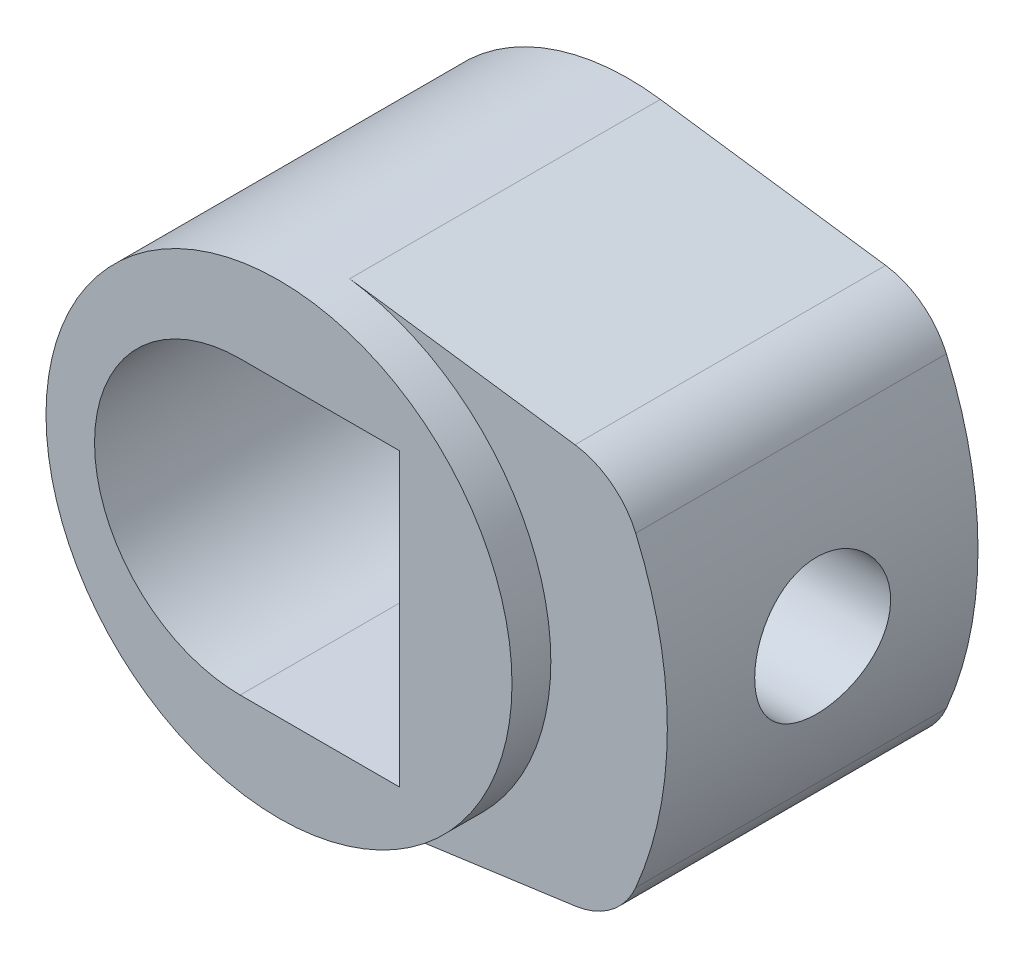
ISO-10303-21;
HEADER;
FILE_DESCRIPTION(('STEP AP214'),'2;1');
FILE_NAME('part.step','',(''),(''),'','','');
FILE_SCHEMA(('AUTOMOTIVE_DESIGN { 1 0 10303 214 1 1 1 1 }'));
ENDSEC;
DATA;
#1=APPLICATION_CONTEXT('core data for automotive mechanical design processes');
#2=APPLICATION_PROTOCOL_DEFINITION('international standard','automotive_design',2000,#1);
#3=PRODUCT_CONTEXT('',#1,'mechanical');
#4=PRODUCT('Part','Part','',(#3));
#5=PRODUCT_RELATED_PRODUCT_CATEGORY('part','',(#4));
#6=PRODUCT_DEFINITION_FORMATION('','',#4);
#7=PRODUCT_DEFINITION_CONTEXT('part definition',#1,'design');
#8=PRODUCT_DEFINITION('design','',#6,#7);
#9=PRODUCT_DEFINITION_SHAPE('','',#8);
#10=(LENGTH_UNIT() NAMED_UNIT(*) SI_UNIT(.MILLI.,.METRE.));
#11=(NAMED_UNIT(*) PLANE_ANGLE_UNIT() SI_UNIT($,.RADIAN.));
#12=(NAMED_UNIT(*) SI_UNIT($,.STERADIAN.) SOLID_ANGLE_UNIT());
#13=UNCERTAINTY_MEASURE_WITH_UNIT(LENGTH_MEASURE(1.E-05),#10,'distance_accuracy_value','');
#14=(GEOMETRIC_REPRESENTATION_CONTEXT(3) GLOBAL_UNCERTAINTY_ASSIGNED_CONTEXT((#13)) GLOBAL_UNIT_ASSIGNED_CONTEXT((#10,
#11,#12)) REPRESENTATION_CONTEXT('',''));
#15=CARTESIAN_POINT('',(0.,0.,0.));
#16=DIRECTION('',(0.,0.,1.));
#17=DIRECTION('',(1.,0.,0.));
#18=AXIS2_PLACEMENT_3D('',#15,#16,#17);
#19=CARTESIAN_POINT('',(0.,0.,-9.));
#20=DIRECTION('',(0.,0.,1.));
#21=DIRECTION('',(1.,0.,0.));
#22=AXIS2_PLACEMENT_3D('',#19,#20,#21);
#23=CYLINDRICAL_SURFACE('',#22,10.);
#24=CARTESIAN_POINT('',(10.,0.,-3.25000000000001));
#25=CARTESIAN_POINT('',(9.99999828550993,-0.0975002189978529,-3.25000384235494));
#26=CARTESIAN_POINT('',(9.99855925305814,-0.195051825485914,-3.25817578126177));
#27=CARTESIAN_POINT('',(9.99295728726595,-0.387414018862523,-3.2906311549575));
#28=CARTESIAN_POINT('',(9.98879192868944,-0.482222086719282,-3.31492893495113));
#29=CARTESIAN_POINT('',(9.9782040279162,-0.666286716106649,-3.37887573799504));
#30=CARTESIAN_POINT('',(9.97178340721726,-0.755547927638459,-3.41851169573414));
#31=CARTESIAN_POINT('',(9.95738907196248,-0.926142975369663,-3.51197438406103));
#32=CARTESIAN_POINT('',(9.94941551484513,-1.00747761392112,-3.56579967631304));
#33=CARTESIAN_POINT('',(9.93270416872809,-1.16077458064915,-3.68671360977965));
#34=CARTESIAN_POINT('',(9.92395990203815,-1.23264164981102,-3.75392213964217));
#35=CARTESIAN_POINT('',(9.90674166321202,-1.36414009649867,-3.89943673693522));
#36=CARTESIAN_POINT('',(9.89826770904785,-1.42377066189349,-3.97774354037016));
#37=CARTESIAN_POINT('',(9.88248675123969,-1.52949079919483,-4.1438935627265));
#38=CARTESIAN_POINT('',(9.87518811175402,-1.57548512024471,-4.23179825310341));
#39=CARTESIAN_POINT('',(9.86267461199113,-1.65201780170522,-4.41423539240781));
#40=CARTESIAN_POINT('',(9.85745959606453,-1.68255731665528,-4.50876734564985));
#41=CARTESIAN_POINT('',(9.84976858920675,-1.72701116059029,-4.70076203144143));
#42=CARTESIAN_POINT('',(9.84726541290427,-1.74109061199909,-4.79818542209425));
#43=CARTESIAN_POINT('',(9.84519938186275,-1.75273685009324,-4.99404146761843));
#44=CARTESIAN_POINT('',(9.84563629768554,-1.75030492528907,-5.09247404313671));
#45=CARTESIAN_POINT('',(9.84937629026662,-1.72913170713862,-5.28636885043278));
#46=CARTESIAN_POINT('',(9.85264661495795,-1.71057677642294,-5.3818521571407));
#47=CARTESIAN_POINT('',(9.86163360747697,-1.65797711614929,-5.56832923234216));
#48=CARTESIAN_POINT('',(9.8673503670103,-1.62393180592481,-5.65932283239451));
#49=CARTESIAN_POINT('',(9.88062103436221,-1.54113146110184,-5.83479054450863));
#50=CARTESIAN_POINT('',(9.88818446324519,-1.49229986742932,-5.91922777986089));
#51=CARTESIAN_POINT('',(9.9042897774119,-1.38136737793408,-6.07878036908094));
#52=CARTESIAN_POINT('',(9.91283174952347,-1.31926530417513,-6.15389489449472));
#53=CARTESIAN_POINT('',(9.93007513845501,-1.18254340376587,-6.29374783449876));
#54=CARTESIAN_POINT('',(9.93877713730826,-1.10776386811213,-6.3583301455674));
#55=CARTESIAN_POINT('',(9.95525225092692,-0.948347681177363,-6.47405494422539));
#56=CARTESIAN_POINT('',(9.96302535851272,-0.863710953717835,-6.52519732793814));
#57=CARTESIAN_POINT('',(9.9767796289067,-0.686829936517542,-6.61260810815593));
#58=CARTESIAN_POINT('',(9.98275901510707,-0.594578218974177,-6.64886177101598));
#59=CARTESIAN_POINT('',(9.99223809398106,-0.405166996122789,-6.70531614693626));
#60=CARTESIAN_POINT('',(9.99573801564457,-0.308007944917595,-6.72551834244392));
#61=CARTESIAN_POINT('',(9.99983277218685,-0.11288455469102,-6.74908251522554));
#62=CARTESIAN_POINT('',(10.0004645449945,-0.0149468247783658,-6.75265862880128));
#63=CARTESIAN_POINT('',(9.99885332409997,0.180127849653306,-6.74344137392768));
#64=CARTESIAN_POINT('',(9.99661045277387,0.277264828083822,-6.73064870231137));
#65=CARTESIAN_POINT('',(9.98952487073635,0.467312333780234,-6.68923510573546));
#66=CARTESIAN_POINT('',(9.98469972832698,0.560246871912314,-6.66072110058933));
#67=CARTESIAN_POINT('',(9.97298839379761,0.740016494745386,-6.58878888978056));
#68=CARTESIAN_POINT('',(9.96610207629161,0.826851207983171,-6.54536977738249));
#69=CARTESIAN_POINT('',(9.95094034029616,0.992880142059938,-6.44437581192406));
#70=CARTESIAN_POINT('',(9.94265215093101,1.07199249157211,-6.38666832163301));
#71=CARTESIAN_POINT('',(9.92564223228564,1.21948701016863,-6.25891699986686));
#72=CARTESIAN_POINT('',(9.91692046810972,1.28786831373203,-6.18887217428031));
#73=CARTESIAN_POINT('',(9.89990574738798,1.41276114994019,-6.03747050493884));
#74=CARTESIAN_POINT('',(9.89161886212633,1.46912742425076,-5.9559930439062));
#75=CARTESIAN_POINT('',(9.87652886958088,1.56737307241149,-5.78460016929627));
#76=CARTESIAN_POINT('',(9.86972571190741,1.60925293827063,-5.69468504242343));
#77=CARTESIAN_POINT('',(9.85841982497657,1.67712403732701,-5.5093608772062));
#78=CARTESIAN_POINT('',(9.8539069632688,1.70318535525292,-5.41397815237364));
#79=CARTESIAN_POINT('',(9.84766806310623,1.73889853467114,-5.2201026745908));
#80=CARTESIAN_POINT('',(9.84594175488492,1.74855198461552,-5.12161022363475));
#81=CARTESIAN_POINT('',(9.84548385302428,1.7511276529647,-4.92576329387006));
#82=CARTESIAN_POINT('',(9.84671130349955,1.74427868698101,-4.82841184522148));
#83=CARTESIAN_POINT('',(9.85193244878436,1.71454110321865,-4.63626987662235));
#84=CARTESIAN_POINT('',(9.85592613187508,1.69165255338979,-4.54147934582455));
#85=CARTESIAN_POINT('',(9.8662135332826,1.63057667594735,-4.35725185730661));
#86=CARTESIAN_POINT('',(9.87250399231302,1.5924110202649,-4.26780752124465));
#87=CARTESIAN_POINT('',(9.88667897086147,1.50188835743545,-4.09655457220386));
#88=CARTESIAN_POINT('',(9.89456358259495,1.44953052926744,-4.01474640134745));
#89=CARTESIAN_POINT('',(9.91116727642969,1.33130126747893,-3.85993571275723));
#90=CARTESIAN_POINT('',(9.91989591712334,1.2652621752978,-3.78706224154226));
#91=CARTESIAN_POINT('',(9.93712979259031,1.12189721587277,-3.65335379981883));
#92=CARTESIAN_POINT('',(9.94563497547267,1.04456875389407,-3.59252160445502));
#93=CARTESIAN_POINT('',(9.96153989384367,0.880110187392859,-3.48419059335616));
#94=CARTESIAN_POINT('',(9.9689306174897,0.792909225494808,-3.43679800089525));
#95=CARTESIAN_POINT('',(9.98168617899541,0.611686626292541,-3.35740872413027));
#96=CARTESIAN_POINT('',(9.98705298938607,0.517671737050136,-3.32539704101543));
#97=CARTESIAN_POINT('',(9.99401440275851,0.352770470007624,-3.28445441936028));
#98=CARTESIAN_POINT('',(9.99624674471591,0.282869378105651,-3.27155523305155));
#99=CARTESIAN_POINT('',(9.99924015281871,0.141987928142366,-3.25432671061564));
#100=CARTESIAN_POINT('',(10.0000012486312,0.0710075918726418,-3.24999720168455));
#101=CARTESIAN_POINT('',(10.,0.,-3.25000000000001));
#102=B_SPLINE_CURVE_WITH_KNOTS('',3,(#24,#25,#26,#27,#28,#29,#30,#31,#32,#33,#34,#35,#36,#37,
#38,#39,#40,#41,#42,#43,#44,#45,#46,#47,#48,#49,#50,#51,#52,#53,#54,#55,#56,#57,#58,#59,#60,#61,
#62,#63,#64,#65,#66,#67,#68,#69,#70,#71,#72,#73,#74,#75,#76,#77,#78,#79,#80,#81,#82,#83,#84,#85,
#86,#87,#88,#89,#90,#91,#92,#93,#94,#95,#96,#97,#98,#99,#100,#101),.UNSPECIFIED.,.T.,.F.,(4,2,2,
2,2,2,2,2,2,2,2,2,2,2,2,2,2,2,2,2,2,2,2,2,2,2,2,2,2,2,2,2,2,2,2,2,2,2,4),(0.,0.292241055917432,
0.58474243233977,0.876995197804949,1.16921834975456,1.46418766399022,1.75917654887267,
2.05617988256741,2.35316102557936,2.64713665953461,2.9410893525595,3.23168883340739,
3.5222992084548,3.8144407835363,4.10660830094939,4.40277504865977,4.69894408536265,
4.99540550415928,5.29183953981626,5.58444486552991,5.87703773520181,6.1676648150215,
6.45830957794646,6.7517607570431,7.04523559252416,7.34207911218896,7.63891254902186,
7.93442106632092,8.22990097369562,8.52130751120692,8.81271281421598,9.10370618969565,
9.39471640281469,9.68952963439962,9.98441073248084,10.2815613716727,10.5784216510767,
10.7912596559021,11.0040933688958),.UNSPECIFIED.);
#103=CARTESIAN_POINT('',(10.,0.,-3.25000000000001));
#104=VERTEX_POINT('',#103);
#105=EDGE_CURVE('E234',#104,#104,#102,.T.);
#106=ORIENTED_EDGE('',*,*,#105,.F.);
#107=EDGE_LOOP('',(#106));
#108=FACE_BOUND('',#107,.T.);
#109=CARTESIAN_POINT('',(0.,0.,-1.));
#110=DIRECTION('',(0.,0.,1.));
#111=DIRECTION('',(1.,0.,0.));
#112=AXIS2_PLACEMENT_3D('',#109,#110,#111);
#113=CIRCLE('',#112,10.);
#114=CARTESIAN_POINT('',(9.18572599151205,-3.95252299283128,-1.));
#115=VERTEX_POINT('',#114);
#116=CARTESIAN_POINT('',(9.18572599151205,3.95252299283127,-1.));
#117=VERTEX_POINT('',#116);
#118=EDGE_CURVE('E230',#115,#117,#113,.T.);
#119=ORIENTED_EDGE('',*,*,#118,.F.);
#120=DIRECTION('',(0.,0.,1.));
#121=VECTOR('',#120,1.);
#122=CARTESIAN_POINT('',(9.18572599151205,-3.95252299283128,-9.));
#123=LINE('',#122,#121);
#124=CARTESIAN_POINT('',(9.18572599151205,-3.95252299283128,-9.));
#125=VERTEX_POINT('',#124);
#126=EDGE_CURVE('E340',#115,#125,#123,.F.);
#127=ORIENTED_EDGE('',*,*,#126,.T.);
#128=CARTESIAN_POINT('',(0.,0.,-9.));
#129=DIRECTION('',(0.,0.,1.));
#130=DIRECTION('',(1.,0.,0.));
#131=AXIS2_PLACEMENT_3D('',#128,#129,#130);
#132=CIRCLE('',#131,10.);
#133=CARTESIAN_POINT('',(9.18572599151205,3.95252299283127,-9.));
#134=VERTEX_POINT('',#133);
#135=EDGE_CURVE('E236',#125,#134,#132,.T.);
#136=ORIENTED_EDGE('',*,*,#135,.T.);
#137=DIRECTION('',(0.,0.,1.));
#138=VECTOR('',#137,1.);
#139=CARTESIAN_POINT('',(9.18572599151205,3.95252299283127,-9.));
#140=LINE('',#139,#138);
#141=EDGE_CURVE('E342',#134,#117,#140,.T.);
#142=ORIENTED_EDGE('',*,*,#141,.T.);
#143=EDGE_LOOP('',(#119,#127,#136,#142));
#144=FACE_BOUND('',#143,.T.);
#145=ADVANCED_FACE('F39',(#108,#144),#23,.T.);
#146=CARTESIAN_POINT('',(1.82001132498641,-5.94370098733896,-9.));
#147=DIRECTION('',(0.136668554164401,-0.990616831223159,0.));
#148=DIRECTION('',(0.990616831223159,0.136668554164401,0.));
#149=AXIS2_PLACEMENT_3D('',#146,#147,#148);
#150=PLANE('',#149);
#151=DIRECTION('',(0.990616831223159,0.136668554164401,0.));
#152=VECTOR('',#151,1.);
#153=CARTESIAN_POINT('',(1.82001132498641,-5.94370098733896,-9.));
#154=LINE('',#153,#152);
#155=CARTESIAN_POINT('',(1.8200113249864,-5.94370098733896,-9.));
#156=VERTEX_POINT('',#155);
#157=CARTESIAN_POINT('',(7.62191790153844,-5.14325205671134,-9.));
#158=VERTEX_POINT('',#157);
#159=EDGE_CURVE('E244',#156,#158,#154,.T.);
#160=ORIENTED_EDGE('',*,*,#159,.T.);
#161=DIRECTION('',(0.,0.,1.));
#162=VECTOR('',#161,1.);
#163=CARTESIAN_POINT('',(7.62191790153845,-5.14325205671134,-9.));
#164=LINE('',#163,#162);
#165=CARTESIAN_POINT('',(7.62191790153844,-5.14325205671134,-1.));
#166=VERTEX_POINT('',#165);
#167=EDGE_CURVE('E356',#158,#166,#164,.T.);
#168=ORIENTED_EDGE('',*,*,#167,.T.);
#169=DIRECTION('',(0.990616831223159,0.136668554164401,0.));
#170=VECTOR('',#169,1.);
#171=CARTESIAN_POINT('',(1.82001132498641,-5.94370098733896,-1.));
#172=LINE('',#171,#170);
#173=CARTESIAN_POINT('',(1.8200113249864,-5.94370098733896,-1.));
#174=VERTEX_POINT('',#173);
#175=EDGE_CURVE('E239',#174,#166,#172,.T.);
#176=ORIENTED_EDGE('',*,*,#175,.F.);
#177=DIRECTION('',(0.,0.,1.));
#178=VECTOR('',#177,1.);
#179=CARTESIAN_POINT('',(1.8200113249864,-5.94370098733896,-9.));
#180=LINE('',#179,#178);
#181=EDGE_CURVE('E235',#156,#174,#180,.T.);
#182=ORIENTED_EDGE('',*,*,#181,.F.);
#183=EDGE_LOOP('',(#160,#168,#176,#182));
#184=FACE_BOUND('',#183,.T.);
#185=ADVANCED_FACE('F320',(#184),#150,.T.);
#186=CARTESIAN_POINT('',(1.,0.,-9.));
#187=DIRECTION('',(0.,0.,1.));
#188=DIRECTION('',(1.,0.,0.));
#189=AXIS2_PLACEMENT_3D('',#186,#187,#188);
#190=CYLINDRICAL_SURFACE('',#189,6.);
#191=ORIENTED_EDGE('',*,*,#181,.T.);
#192=CARTESIAN_POINT('',(1.,0.,-1.));
#193=DIRECTION('',(0.,0.,1.));
#194=DIRECTION('',(1.,0.,0.));
#195=AXIS2_PLACEMENT_3D('',#192,#193,#194);
#196=CIRCLE('',#195,6.);
#197=CARTESIAN_POINT('',(1.82001132498641,5.94370098733895,-1.));
#198=VERTEX_POINT('',#197);
#199=EDGE_CURVE('E231',#174,#198,#196,.T.);
#200=ORIENTED_EDGE('',*,*,#199,.T.);
#201=DIRECTION('',(0.,0.,1.));
#202=VECTOR('',#201,1.);
#203=CARTESIAN_POINT('',(1.82001132498641,5.94370098733895,-9.));
#204=LINE('',#203,#202);
#205=CARTESIAN_POINT('',(1.82001132498641,5.94370098733895,-9.));
#206=VERTEX_POINT('',#205);
#207=EDGE_CURVE('E247',#206,#198,#204,.T.);
#208=ORIENTED_EDGE('',*,*,#207,.F.);
#209=CARTESIAN_POINT('',(1.,0.,-9.));
#210=DIRECTION('',(0.,0.,1.));
#211=DIRECTION('',(1.,0.,0.));
#212=AXIS2_PLACEMENT_3D('',#209,#210,#211);
#213=CIRCLE('',#212,6.);
#214=EDGE_CURVE('E241',#206,#156,#213,.T.);
#215=ORIENTED_EDGE('',*,*,#214,.T.);
#216=EDGE_LOOP('',(#191,#200,#208,#215));
#217=FACE_BOUND('',#216,.T.);
#218=CARTESIAN_POINT('',(1.,0.,0.));
#219=DIRECTION('',(0.,0.,1.));
#220=DIRECTION('',(1.,0.,0.));
#221=AXIS2_PLACEMENT_3D('',#218,#219,#220);
#222=CIRCLE('',#221,6.);
#223=CARTESIAN_POINT('',(7.,0.,0.));
#224=VERTEX_POINT('',#223);
#225=EDGE_CURVE('E221',#224,#224,#222,.T.);
#226=ORIENTED_EDGE('',*,*,#225,.F.);
#227=EDGE_LOOP('',(#226));
#228=FACE_BOUND('',#227,.T.);
#229=ADVANCED_FACE('F323',(#217,#228),#190,.T.);
#230=CARTESIAN_POINT('',(8.66025403784439,5.,-9.));
#231=DIRECTION('',(0.136668554164401,0.990616831223159,0.));
#232=DIRECTION('',(-0.990616831223159,0.136668554164401,0.));
#233=AXIS2_PLACEMENT_3D('',#230,#231,#232);
#234=PLANE('',#233);
#235=DIRECTION('',(-0.990616831223159,0.136668554164401,0.));
#236=VECTOR('',#235,1.);
#237=CARTESIAN_POINT('',(8.66025403784439,5.,-1.));
#238=LINE('',#237,#236);
#239=CARTESIAN_POINT('',(7.62191790153845,5.14325205671134,-1.));
#240=VERTEX_POINT('',#239);
#241=EDGE_CURVE('E250',#240,#198,#238,.T.);
#242=ORIENTED_EDGE('',*,*,#241,.F.);
#243=DIRECTION('',(0.,0.,1.));
#244=VECTOR('',#243,1.);
#245=CARTESIAN_POINT('',(7.62191790153845,5.14325205671134,-9.));
#246=LINE('',#245,#244);
#247=CARTESIAN_POINT('',(7.62191790153845,5.14325205671134,-9.));
#248=VERTEX_POINT('',#247);
#249=EDGE_CURVE('E11',#240,#248,#246,.F.);
#250=ORIENTED_EDGE('',*,*,#249,.T.);
#251=DIRECTION('',(-0.990616831223159,0.136668554164401,0.));
#252=VECTOR('',#251,1.);
#253=CARTESIAN_POINT('',(8.66025403784439,5.,-9.));
#254=LINE('',#253,#252);
#255=EDGE_CURVE('E238',#248,#206,#254,.T.);
#256=ORIENTED_EDGE('',*,*,#255,.T.);
#257=ORIENTED_EDGE('',*,*,#207,.T.);
#258=EDGE_LOOP('',(#242,#250,#256,#257));
#259=FACE_BOUND('',#258,.T.);
#260=ADVANCED_FACE('F316',(#259),#234,.T.);
#261=CARTESIAN_POINT('',(0.,0.,-9.));
#262=DIRECTION('',(0.,0.,1.));
#263=DIRECTION('',(1.,0.,0.));
#264=AXIS2_PLACEMENT_3D('',#261,#262,#263);
#265=PLANE('',#264);
#266=DIRECTION('',(-1.,0.,0.));
#267=VECTOR('',#266,1.);
#268=CARTESIAN_POINT('',(7.,3.,-9.));
#269=LINE('',#268,#267);
#270=CARTESIAN_POINT('',(7.,3.,-9.));
#271=VERTEX_POINT('',#270);
#272=CARTESIAN_POINT('',(4.7,3.,-9.));
#273=VERTEX_POINT('',#272);
#274=EDGE_CURVE('E211',#271,#273,#269,.T.);
#275=ORIENTED_EDGE('',*,*,#274,.T.);
#276=CARTESIAN_POINT('',(4.7,3.6,-9.));
#277=DIRECTION('',(0.,0.,1.));
#278=DIRECTION('',(1.,0.,0.));
#279=AXIS2_PLACEMENT_3D('',#276,#277,#278);
#280=CIRCLE('',#279,0.6);
#281=CARTESIAN_POINT('',(4.1,3.6,-9.));
#282=VERTEX_POINT('',#281);
#283=EDGE_CURVE('E394',#273,#282,#280,.F.);
#284=ORIENTED_EDGE('',*,*,#283,.T.);
#285=DIRECTION('',(0.,1.,0.));
#286=VECTOR('',#285,1.);
#287=CARTESIAN_POINT('',(4.1,-3.75,-9.));
#288=LINE('',#287,#286);
#289=CARTESIAN_POINT('',(4.1,3.75,-9.));
#290=VERTEX_POINT('',#289);
#291=EDGE_CURVE('E201',#282,#290,#288,.T.);
#292=ORIENTED_EDGE('',*,*,#291,.T.);
#293=DIRECTION('',(-1.,0.,0.));
#294=VECTOR('',#293,1.);
#295=CARTESIAN_POINT('',(4.1,3.75,-9.));
#296=LINE('',#295,#294);
#297=CARTESIAN_POINT('',(0.,3.75,-9.));
#298=VERTEX_POINT('',#297);
#299=EDGE_CURVE('E204',#290,#298,#296,.T.);
#300=ORIENTED_EDGE('',*,*,#299,.T.);
#301=CARTESIAN_POINT('',(0.,0.,-9.));
#302=DIRECTION('',(0.,0.,1.));
#303=DIRECTION('',(1.,0.,0.));
#304=AXIS2_PLACEMENT_3D('',#301,#302,#303);
#305=CIRCLE('',#304,3.75);
#306=CARTESIAN_POINT('',(0.,-3.75,-9.));
#307=VERTEX_POINT('',#306);
#308=EDGE_CURVE('E194',#298,#307,#305,.T.);
#309=ORIENTED_EDGE('',*,*,#308,.T.);
#310=DIRECTION('',(1.,0.,0.));
#311=VECTOR('',#310,1.);
#312=CARTESIAN_POINT('',(0.,-3.75,-9.));
#313=LINE('',#312,#311);
#314=CARTESIAN_POINT('',(4.1,-3.75,-9.));
#315=VERTEX_POINT('',#314);
#316=EDGE_CURVE('E197',#307,#315,#313,.T.);
#317=ORIENTED_EDGE('',*,*,#316,.T.);
#318=CARTESIAN_POINT('',(4.1,-3.6,-9.));
#319=VERTEX_POINT('',#318);
#320=EDGE_CURVE('E202',#315,#319,#288,.T.);
#321=ORIENTED_EDGE('',*,*,#320,.T.);
#322=CARTESIAN_POINT('',(4.7,-3.6,-9.));
#323=DIRECTION('',(0.,0.,1.));
#324=DIRECTION('',(1.,0.,0.));
#325=AXIS2_PLACEMENT_3D('',#322,#323,#324);
#326=CIRCLE('',#325,0.6);
#327=CARTESIAN_POINT('',(4.7,-3.,-9.));
#328=VERTEX_POINT('',#327);
#329=EDGE_CURVE('E186',#319,#328,#326,.F.);
#330=ORIENTED_EDGE('',*,*,#329,.T.);
#331=DIRECTION('',(-1.,0.,0.));
#332=VECTOR('',#331,1.);
#333=CARTESIAN_POINT('',(7.,-3.,-9.));
#334=LINE('',#333,#332);
#335=CARTESIAN_POINT('',(7.,-3.,-9.));
#336=VERTEX_POINT('',#335);
#337=EDGE_CURVE('E163',#336,#328,#334,.T.);
#338=ORIENTED_EDGE('',*,*,#337,.F.);
#339=DIRECTION('',(0.,-1.,0.));
#340=VECTOR('',#339,1.);
#341=CARTESIAN_POINT('',(7.,3.,-9.));
#342=LINE('',#341,#340);
#343=EDGE_CURVE('E171',#271,#336,#342,.T.);
#344=ORIENTED_EDGE('',*,*,#343,.F.);
#345=EDGE_LOOP('',(#275,#284,#292,#300,#309,#317,#321,#330,#338,#344));
#346=FACE_BOUND('',#345,.T.);
#347=ORIENTED_EDGE('',*,*,#135,.F.);
#348=CARTESIAN_POINT('',(7.34858079320964,-3.16201839426502,-9.));
#349=DIRECTION('',(0.,0.,1.));
#350=DIRECTION('',(1.,0.,0.));
#351=AXIS2_PLACEMENT_3D('',#348,#349,#350);
#352=CIRCLE('',#351,2.);
#353=EDGE_CURVE('E47',#125,#158,#352,.F.);
#354=ORIENTED_EDGE('',*,*,#353,.T.);
#355=ORIENTED_EDGE('',*,*,#159,.F.);
#356=ORIENTED_EDGE('',*,*,#214,.F.);
#357=ORIENTED_EDGE('',*,*,#255,.F.);
#358=CARTESIAN_POINT('',(7.34858079320964,3.16201839426502,-9.));
#359=DIRECTION('',(0.,0.,1.));
#360=DIRECTION('',(1.,0.,0.));
#361=AXIS2_PLACEMENT_3D('',#358,#359,#360);
#362=CIRCLE('',#361,2.);
#363=EDGE_CURVE('E59',#248,#134,#362,.F.);
#364=ORIENTED_EDGE('',*,*,#363,.T.);
#365=EDGE_LOOP('',(#347,#354,#355,#356,#357,#364));
#366=FACE_BOUND('',#365,.T.);
#367=ADVANCED_FACE('F183',(#346,#366),#265,.F.);
#368=CARTESIAN_POINT('',(0.,0.,-1.));
#369=DIRECTION('',(0.,0.,1.));
#370=DIRECTION('',(1.,0.,0.));
#371=AXIS2_PLACEMENT_3D('',#368,#369,#370);
#372=PLANE('',#371);
#373=ORIENTED_EDGE('',*,*,#175,.T.);
#374=CARTESIAN_POINT('',(7.34858079320964,-3.16201839426502,-1.));
#375=DIRECTION('',(0.,0.,1.));
#376=DIRECTION('',(1.,0.,0.));
#377=AXIS2_PLACEMENT_3D('',#374,#375,#376);
#378=CIRCLE('',#377,2.);
#379=EDGE_CURVE('E347',#166,#115,#378,.T.);
#380=ORIENTED_EDGE('',*,*,#379,.T.);
#381=ORIENTED_EDGE('',*,*,#118,.T.);
#382=CARTESIAN_POINT('',(7.34858079320964,3.16201839426502,-1.));
#383=DIRECTION('',(0.,0.,1.));
#384=DIRECTION('',(1.,0.,0.));
#385=AXIS2_PLACEMENT_3D('',#382,#383,#384);
#386=CIRCLE('',#385,2.);
#387=EDGE_CURVE('E357',#117,#240,#386,.T.);
#388=ORIENTED_EDGE('',*,*,#387,.T.);
#389=ORIENTED_EDGE('',*,*,#241,.T.);
#390=ORIENTED_EDGE('',*,*,#199,.F.);
#391=EDGE_LOOP('',(#373,#380,#381,#388,#389,#390));
#392=FACE_BOUND('',#391,.T.);
#393=ADVANCED_FACE('F312',(#392),#372,.T.);
#394=CARTESIAN_POINT('',(1.,0.,0.));
#395=DIRECTION('',(0.,0.,1.));
#396=DIRECTION('',(1.,0.,0.));
#397=AXIS2_PLACEMENT_3D('',#394,#395,#396);
#398=PLANE('',#397);
#399=CARTESIAN_POINT('',(0.,0.,0.));
#400=DIRECTION('',(0.,0.,1.));
#401=DIRECTION('',(1.,0.,0.));
#402=AXIS2_PLACEMENT_3D('',#399,#400,#401);
#403=CIRCLE('',#402,3.75);
#404=CARTESIAN_POINT('',(0.,3.75,0.));
#405=VERTEX_POINT('',#404);
#406=CARTESIAN_POINT('',(0.,-3.75,0.));
#407=VERTEX_POINT('',#406);
#408=EDGE_CURVE('E208',#405,#407,#403,.T.);
#409=ORIENTED_EDGE('',*,*,#408,.F.);
#410=DIRECTION('',(-1.,0.,0.));
#411=VECTOR('',#410,1.);
#412=CARTESIAN_POINT('',(4.1,3.75,0.));
#413=LINE('',#412,#411);
#414=CARTESIAN_POINT('',(4.1,3.75,0.));
#415=VERTEX_POINT('',#414);
#416=EDGE_CURVE('E198',#415,#405,#413,.T.);
#417=ORIENTED_EDGE('',*,*,#416,.F.);
#418=DIRECTION('',(0.,1.,0.));
#419=VECTOR('',#418,1.);
#420=CARTESIAN_POINT('',(4.1,-3.75,0.));
#421=LINE('',#420,#419);
#422=CARTESIAN_POINT('',(4.1,-3.75,0.));
#423=VERTEX_POINT('',#422);
#424=EDGE_CURVE('E214',#423,#415,#421,.T.);
#425=ORIENTED_EDGE('',*,*,#424,.F.);
#426=DIRECTION('',(1.,0.,0.));
#427=VECTOR('',#426,1.);
#428=CARTESIAN_POINT('',(0.,-3.75,0.));
#429=LINE('',#428,#427);
#430=EDGE_CURVE('E210',#407,#423,#429,.T.);
#431=ORIENTED_EDGE('',*,*,#430,.F.);
#432=EDGE_LOOP('',(#409,#417,#425,#431));
#433=FACE_BOUND('',#432,.T.);
#434=ORIENTED_EDGE('',*,*,#225,.T.);
#435=EDGE_LOOP('',(#434));
#436=FACE_BOUND('',#435,.T.);
#437=ADVANCED_FACE('F308',(#433,#436),#398,.T.);
#438=CARTESIAN_POINT('',(0.,0.,-9.));
#439=DIRECTION('',(0.,0.,1.));
#440=DIRECTION('',(1.,0.,0.));
#441=AXIS2_PLACEMENT_3D('',#438,#439,#440);
#442=CYLINDRICAL_SURFACE('',#441,3.75);
#443=ORIENTED_EDGE('',*,*,#408,.T.);
#444=DIRECTION('',(0.,0.,1.));
#445=VECTOR('',#444,1.);
#446=CARTESIAN_POINT('',(0.,-3.75,-9.));
#447=LINE('',#446,#445);
#448=EDGE_CURVE('E207',#307,#407,#447,.T.);
#449=ORIENTED_EDGE('',*,*,#448,.F.);
#450=ORIENTED_EDGE('',*,*,#308,.F.);
#451=DIRECTION('',(0.,0.,1.));
#452=VECTOR('',#451,1.);
#453=CARTESIAN_POINT('',(0.,3.75,-9.));
#454=LINE('',#453,#452);
#455=EDGE_CURVE('E219',#298,#405,#454,.T.);
#456=ORIENTED_EDGE('',*,*,#455,.T.);
#457=EDGE_LOOP('',(#443,#449,#450,#456));
#458=FACE_BOUND('',#457,.T.);
#459=ADVANCED_FACE('F298',(#458),#442,.F.);
#460=CARTESIAN_POINT('',(4.1,3.75,-9.));
#461=DIRECTION('',(0.,1.,0.));
#462=DIRECTION('',(0.,0.,1.));
#463=AXIS2_PLACEMENT_3D('',#460,#461,#462);
#464=PLANE('',#463);
#465=ORIENTED_EDGE('',*,*,#416,.T.);
#466=ORIENTED_EDGE('',*,*,#455,.F.);
#467=ORIENTED_EDGE('',*,*,#299,.F.);
#468=DIRECTION('',(0.,0.,1.));
#469=VECTOR('',#468,1.);
#470=CARTESIAN_POINT('',(4.1,3.75,-9.));
#471=LINE('',#470,#469);
#472=EDGE_CURVE('E222',#290,#415,#471,.T.);
#473=ORIENTED_EDGE('',*,*,#472,.T.);
#474=EDGE_LOOP('',(#465,#466,#467,#473));
#475=FACE_BOUND('',#474,.T.);
#476=ADVANCED_FACE('F294',(#475),#464,.F.);
#477=CARTESIAN_POINT('',(4.1,-3.75,-9.));
#478=DIRECTION('',(1.,0.,0.));
#479=DIRECTION('',(0.,0.,-1.));
#480=AXIS2_PLACEMENT_3D('',#477,#478,#479);
#481=PLANE('',#480);
#482=ORIENTED_EDGE('',*,*,#291,.F.);
#483=DIRECTION('',(0.,0.,-1.));
#484=VECTOR('',#483,1.);
#485=CARTESIAN_POINT('',(4.1,3.6,-9.));
#486=LINE('',#485,#484);
#487=CARTESIAN_POINT('',(4.1,3.6,-3.6143593539449));
#488=VERTEX_POINT('',#487);
#489=EDGE_CURVE('E385',#282,#488,#486,.F.);
#490=ORIENTED_EDGE('',*,*,#489,.T.);
#491=DIRECTION('',(0.,0.866025403784439,-0.499999999999999));
#492=VECTOR('',#491,1.);
#493=CARTESIAN_POINT('',(4.1,0.,-1.53589838486225));
#494=LINE('',#493,#492);
#495=CARTESIAN_POINT('',(4.1,0.,-1.53589838486225));
#496=VERTEX_POINT('',#495);
#497=EDGE_CURVE('E181',#496,#488,#494,.T.);
#498=ORIENTED_EDGE('',*,*,#497,.F.);
#499=DIRECTION('',(0.,0.866025403784439,0.5));
#500=VECTOR('',#499,1.);
#501=CARTESIAN_POINT('',(4.1,-3.,-3.26794919243112));
#502=LINE('',#501,#500);
#503=CARTESIAN_POINT('',(4.1,-3.6,-3.6143593539449));
#504=VERTEX_POINT('',#503);
#505=EDGE_CURVE('E404',#504,#496,#502,.T.);
#506=ORIENTED_EDGE('',*,*,#505,.F.);
#507=DIRECTION('',(0.,0.,1.));
#508=VECTOR('',#507,1.);
#509=CARTESIAN_POINT('',(4.1,-3.6,-9.));
#510=LINE('',#509,#508);
#511=EDGE_CURVE('E392',#504,#319,#510,.F.);
#512=ORIENTED_EDGE('',*,*,#511,.T.);
#513=ORIENTED_EDGE('',*,*,#320,.F.);
#514=DIRECTION('',(0.,0.,1.));
#515=VECTOR('',#514,1.);
#516=CARTESIAN_POINT('',(4.1,-3.75,-9.));
#517=LINE('',#516,#515);
#518=EDGE_CURVE('E224',#315,#423,#517,.T.);
#519=ORIENTED_EDGE('',*,*,#518,.T.);
#520=ORIENTED_EDGE('',*,*,#424,.T.);
#521=ORIENTED_EDGE('',*,*,#472,.F.);
#522=EDGE_LOOP('',(#482,#490,#498,#506,#512,#513,#519,#520,#521));
#523=FACE_BOUND('',#522,.T.);
#524=ADVANCED_FACE('F297',(#523),#481,.F.);
#525=CARTESIAN_POINT('',(0.,-3.75,-9.));
#526=DIRECTION('',(0.,-1.,0.));
#527=DIRECTION('',(0.,0.,-1.));
#528=AXIS2_PLACEMENT_3D('',#525,#526,#527);
#529=PLANE('',#528);
#530=ORIENTED_EDGE('',*,*,#430,.T.);
#531=ORIENTED_EDGE('',*,*,#518,.F.);
#532=ORIENTED_EDGE('',*,*,#316,.F.);
#533=ORIENTED_EDGE('',*,*,#448,.T.);
#534=EDGE_LOOP('',(#530,#531,#532,#533));
#535=FACE_BOUND('',#534,.T.);
#536=ADVANCED_FACE('F283',(#535),#529,.F.);
#537=CARTESIAN_POINT('',(7.,3.,-3.26794919243112));
#538=DIRECTION('',(0.,1.,0.));
#539=DIRECTION('',(0.,0.,1.));
#540=AXIS2_PLACEMENT_3D('',#537,#538,#539);
#541=PLANE('',#540);
#542=DIRECTION('',(-1.,0.,0.));
#543=VECTOR('',#542,1.);
#544=CARTESIAN_POINT('',(7.,3.,-3.26794919243112));
#545=LINE('',#544,#543);
#546=CARTESIAN_POINT('',(7.,3.,-3.26794919243112));
#547=VERTEX_POINT('',#546);
#548=CARTESIAN_POINT('',(4.7,3.,-3.26794919243112));
#549=VERTEX_POINT('',#548);
#550=EDGE_CURVE('E395',#547,#549,#545,.T.);
#551=ORIENTED_EDGE('',*,*,#550,.T.);
#552=DIRECTION('',(0.,0.,-1.));
#553=VECTOR('',#552,1.);
#554=CARTESIAN_POINT('',(4.7,3.,-3.26794919243112));
#555=LINE('',#554,#553);
#556=EDGE_CURVE('E265',#549,#273,#555,.T.);
#557=ORIENTED_EDGE('',*,*,#556,.T.);
#558=ORIENTED_EDGE('',*,*,#274,.F.);
#559=DIRECTION('',(0.,0.,-1.));
#560=VECTOR('',#559,1.);
#561=CARTESIAN_POINT('',(7.,3.,-3.26794919243112));
#562=LINE('',#561,#560);
#563=EDGE_CURVE('E178',#547,#271,#562,.T.);
#564=ORIENTED_EDGE('',*,*,#563,.F.);
#565=EDGE_LOOP('',(#551,#557,#558,#564));
#566=FACE_BOUND('',#565,.T.);
#567=ADVANCED_FACE('F279',(#566),#541,.F.);
#568=CARTESIAN_POINT('',(7.,0.,-1.53589838486225));
#569=DIRECTION('',(0.,0.499999999999999,0.866025403784439));
#570=DIRECTION('',(0.,-0.866025403784439,0.499999999999999));
#571=AXIS2_PLACEMENT_3D('',#568,#569,#570);
#572=PLANE('',#571);
#573=ORIENTED_EDGE('',*,*,#497,.T.);
#574=CARTESIAN_POINT('',(4.7,3.6,-3.6143593539449));
#575=DIRECTION('',(0.,0.499999999999999,0.866025403784439));
#576=DIRECTION('',(0.,0.866025403784439,-0.499999999999999));
#577=AXIS2_PLACEMENT_3D('',#574,#575,#576);
#578=ELLIPSE('',#577,0.69282032302755,0.6);
#579=EDGE_CURVE('E362',#488,#549,#578,.T.);
#580=ORIENTED_EDGE('',*,*,#579,.T.);
#581=ORIENTED_EDGE('',*,*,#550,.F.);
#582=DIRECTION('',(0.,0.866025403784439,-0.499999999999999));
#583=VECTOR('',#582,1.);
#584=CARTESIAN_POINT('',(7.,0.,-1.53589838486225));
#585=LINE('',#584,#583);
#586=CARTESIAN_POINT('',(7.,0.,-1.53589838486225));
#587=VERTEX_POINT('',#586);
#588=EDGE_CURVE('E190',#587,#547,#585,.T.);
#589=ORIENTED_EDGE('',*,*,#588,.F.);
#590=DIRECTION('',(-1.,0.,0.));
#591=VECTOR('',#590,1.);
#592=CARTESIAN_POINT('',(7.,0.,-1.53589838486225));
#593=LINE('',#592,#591);
#594=EDGE_CURVE('E188',#587,#496,#593,.T.);
#595=ORIENTED_EDGE('',*,*,#594,.T.);
#596=EDGE_LOOP('',(#573,#580,#581,#589,#595));
#597=FACE_BOUND('',#596,.T.);
#598=ADVANCED_FACE('F282',(#597),#572,.F.);
#599=CARTESIAN_POINT('',(7.,-3.,-3.26794919243112));
#600=DIRECTION('',(0.,-0.5,0.866025403784439));
#601=DIRECTION('',(0.,-0.866025403784439,-0.5));
#602=AXIS2_PLACEMENT_3D('',#599,#600,#601);
#603=PLANE('',#602);
#604=ORIENTED_EDGE('',*,*,#505,.T.);
#605=ORIENTED_EDGE('',*,*,#594,.F.);
#606=DIRECTION('',(0.,0.866025403784439,0.5));
#607=VECTOR('',#606,1.);
#608=CARTESIAN_POINT('',(7.,-3.,-3.26794919243112));
#609=LINE('',#608,#607);
#610=CARTESIAN_POINT('',(7.,-3.,-3.26794919243112));
#611=VERTEX_POINT('',#610);
#612=EDGE_CURVE('E170',#611,#587,#609,.T.);
#613=ORIENTED_EDGE('',*,*,#612,.F.);
#614=DIRECTION('',(-1.,0.,0.));
#615=VECTOR('',#614,1.);
#616=CARTESIAN_POINT('',(7.,-3.,-3.26794919243112));
#617=LINE('',#616,#615);
#618=CARTESIAN_POINT('',(4.7,-3.,-3.26794919243112));
#619=VERTEX_POINT('',#618);
#620=EDGE_CURVE('E166',#611,#619,#617,.T.);
#621=ORIENTED_EDGE('',*,*,#620,.T.);
#622=CARTESIAN_POINT('',(4.7,-3.6,-3.6143593539449));
#623=DIRECTION('',(0.,-0.5,0.866025403784439));
#624=DIRECTION('',(0.,0.866025403784439,0.5));
#625=AXIS2_PLACEMENT_3D('',#622,#623,#624);
#626=ELLIPSE('',#625,0.69282032302755,0.6);
#627=EDGE_CURVE('E358',#619,#504,#626,.T.);
#628=ORIENTED_EDGE('',*,*,#627,.T.);
#629=EDGE_LOOP('',(#604,#605,#613,#621,#628));
#630=FACE_BOUND('',#629,.T.);
#631=ADVANCED_FACE('F287',(#630),#603,.F.);
#632=CARTESIAN_POINT('',(7.,-3.,-9.));
#633=DIRECTION('',(0.,-1.,0.));
#634=DIRECTION('',(0.,0.,-1.));
#635=AXIS2_PLACEMENT_3D('',#632,#633,#634);
#636=PLANE('',#635);
#637=ORIENTED_EDGE('',*,*,#337,.T.);
#638=DIRECTION('',(0.,0.,1.));
#639=VECTOR('',#638,1.);
#640=CARTESIAN_POINT('',(4.7,-3.,-9.));
#641=LINE('',#640,#639);
#642=EDGE_CURVE('E388',#328,#619,#641,.T.);
#643=ORIENTED_EDGE('',*,*,#642,.T.);
#644=ORIENTED_EDGE('',*,*,#620,.F.);
#645=DIRECTION('',(0.,0.,1.));
#646=VECTOR('',#645,1.);
#647=CARTESIAN_POINT('',(7.,-3.,-9.));
#648=LINE('',#647,#646);
#649=EDGE_CURVE('E158',#336,#611,#648,.T.);
#650=ORIENTED_EDGE('',*,*,#649,.F.);
#651=EDGE_LOOP('',(#637,#643,#644,#650));
#652=FACE_BOUND('',#651,.T.);
#653=ADVANCED_FACE('F160',(#652),#636,.F.);
#654=CARTESIAN_POINT('',(7.,0.,0.));
#655=DIRECTION('',(-1.,0.,0.));
#656=DIRECTION('',(0.,0.,1.));
#657=AXIS2_PLACEMENT_3D('',#654,#655,#656);
#658=PLANE('',#657);
#659=CARTESIAN_POINT('',(7.,0.,-5.));
#660=DIRECTION('',(-1.,0.,0.));
#661=DIRECTION('',(0.,0.,1.));
#662=AXIS2_PLACEMENT_3D('',#659,#660,#661);
#663=CIRCLE('',#662,1.74999999999999);
#664=CARTESIAN_POINT('',(7.,0.,-3.25000000000001));
#665=VERTEX_POINT('',#664);
#666=EDGE_CURVE('E406',#665,#665,#663,.T.);
#667=ORIENTED_EDGE('',*,*,#666,.F.);
#668=EDGE_LOOP('',(#667));
#669=FACE_BOUND('',#668,.T.);
#670=ORIENTED_EDGE('',*,*,#343,.T.);
#671=ORIENTED_EDGE('',*,*,#649,.T.);
#672=ORIENTED_EDGE('',*,*,#612,.T.);
#673=ORIENTED_EDGE('',*,*,#588,.T.);
#674=ORIENTED_EDGE('',*,*,#563,.T.);
#675=EDGE_LOOP('',(#670,#671,#672,#673,#674));
#676=FACE_BOUND('',#675,.T.);
#677=ADVANCED_FACE('F175',(#669,#676),#658,.T.);
#678=CARTESIAN_POINT('',(7.,0.,-5.));
#679=DIRECTION('',(-1.,0.,0.));
#680=DIRECTION('',(0.,0.,1.));
#681=AXIS2_PLACEMENT_3D('',#678,#679,#680);
#682=CYLINDRICAL_SURFACE('',#681,1.74999999999999);
#683=ORIENTED_EDGE('',*,*,#105,.T.);
#684=EDGE_LOOP('',(#683));
#685=FACE_BOUND('',#684,.T.);
#686=ORIENTED_EDGE('',*,*,#666,.T.);
#687=EDGE_LOOP('',(#686));
#688=FACE_BOUND('',#687,.T.);
#689=ADVANCED_FACE('F270',(#685,#688),#682,.F.);
#690=CARTESIAN_POINT('',(4.7,3.6,-3.26794919243112));
#691=DIRECTION('',(0.,0.,-1.));
#692=DIRECTION('',(-1.,0.,0.));
#693=AXIS2_PLACEMENT_3D('',#690,#691,#692);
#694=CYLINDRICAL_SURFACE('',#693,0.6);
#695=ORIENTED_EDGE('',*,*,#579,.F.);
#696=ORIENTED_EDGE('',*,*,#489,.F.);
#697=ORIENTED_EDGE('',*,*,#283,.F.);
#698=ORIENTED_EDGE('',*,*,#556,.F.);
#699=EDGE_LOOP('',(#695,#696,#697,#698));
#700=FACE_BOUND('',#699,.T.);
#701=ADVANCED_FACE('F274',(#700),#694,.T.);
#702=CARTESIAN_POINT('',(4.7,-3.6,-9.));
#703=DIRECTION('',(0.,0.,1.));
#704=DIRECTION('',(1.,0.,0.));
#705=AXIS2_PLACEMENT_3D('',#702,#703,#704);
#706=CYLINDRICAL_SURFACE('',#705,0.6);
#707=ORIENTED_EDGE('',*,*,#329,.F.);
#708=ORIENTED_EDGE('',*,*,#511,.F.);
#709=ORIENTED_EDGE('',*,*,#627,.F.);
#710=ORIENTED_EDGE('',*,*,#642,.F.);
#711=EDGE_LOOP('',(#707,#708,#709,#710));
#712=FACE_BOUND('',#711,.T.);
#713=ADVANCED_FACE('F372',(#712),#706,.T.);
#714=CARTESIAN_POINT('',(7.34858079320964,-3.16201839426502,-9.));
#715=DIRECTION('',(0.,0.,1.));
#716=DIRECTION('',(1.,0.,0.));
#717=AXIS2_PLACEMENT_3D('',#714,#715,#716);
#718=CYLINDRICAL_SURFACE('',#717,2.);
#719=ORIENTED_EDGE('',*,*,#353,.F.);
#720=ORIENTED_EDGE('',*,*,#126,.F.);
#721=ORIENTED_EDGE('',*,*,#379,.F.);
#722=ORIENTED_EDGE('',*,*,#167,.F.);
#723=EDGE_LOOP('',(#719,#720,#721,#722));
#724=FACE_BOUND('',#723,.T.);
#725=ADVANCED_FACE('F345',(#724),#718,.T.);
#726=CARTESIAN_POINT('',(7.34858079320964,3.16201839426502,-9.));
#727=DIRECTION('',(0.,0.,1.));
#728=DIRECTION('',(1.,0.,0.));
#729=AXIS2_PLACEMENT_3D('',#726,#727,#728);
#730=CYLINDRICAL_SURFACE('',#729,2.);
#731=ORIENTED_EDGE('',*,*,#363,.F.);
#732=ORIENTED_EDGE('',*,*,#249,.F.);
#733=ORIENTED_EDGE('',*,*,#387,.F.);
#734=ORIENTED_EDGE('',*,*,#141,.F.);
#735=EDGE_LOOP('',(#731,#732,#733,#734));
#736=FACE_BOUND('',#735,.T.);
#737=ADVANCED_FACE('F41',(#736),#730,.T.);
#738=CLOSED_SHELL('',(#145,#185,#229,#260,#367,#393,#437,#459,#476,#524,#536,#567,#598,#631,
#653,#677,#689,#701,#713,#725,#737));
#739=MANIFOLD_SOLID_BREP('B2',#738);
#740=ADVANCED_BREP_SHAPE_REPRESENTATION('',(#18,#739),#14);
#741=SHAPE_DEFINITION_REPRESENTATION(#9,#740);
ENDSEC;
END-ISO-10303-21;
